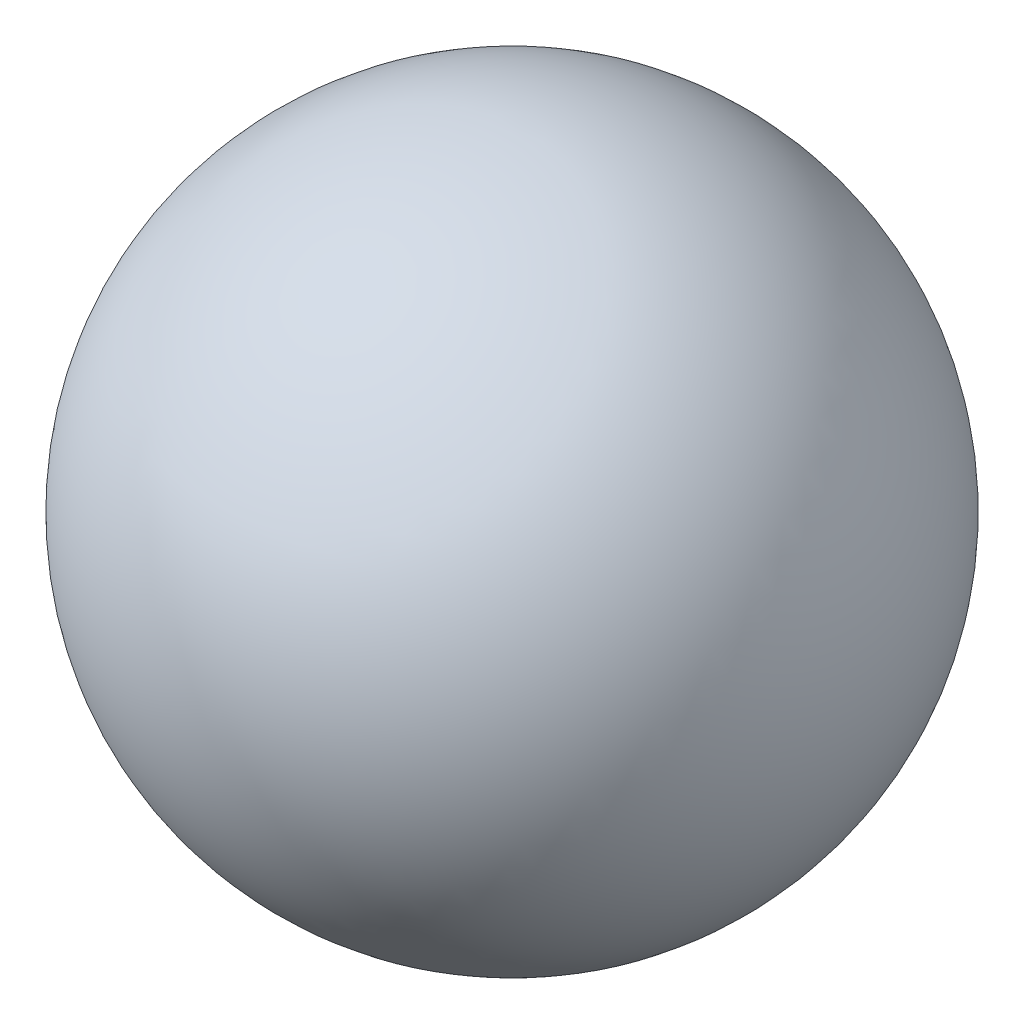
ISO-10303-21;
HEADER;
FILE_DESCRIPTION(('STEP AP214'),'2;1');
FILE_NAME('part.step','',(''),(''),'','','');
FILE_SCHEMA(('AUTOMOTIVE_DESIGN { 1 0 10303 214 1 1 1 1 }'));
ENDSEC;
DATA;
#1=APPLICATION_CONTEXT('core data for automotive mechanical design processes');
#2=APPLICATION_PROTOCOL_DEFINITION('international standard','automotive_design',2000,#1);
#3=PRODUCT_CONTEXT('',#1,'mechanical');
#4=PRODUCT('Part','Part','',(#3));
#5=PRODUCT_RELATED_PRODUCT_CATEGORY('part','',(#4));
#6=PRODUCT_DEFINITION_FORMATION('','',#4);
#7=PRODUCT_DEFINITION_CONTEXT('part definition',#1,'design');
#8=PRODUCT_DEFINITION('design','',#6,#7);
#9=PRODUCT_DEFINITION_SHAPE('','',#8);
#10=(LENGTH_UNIT() NAMED_UNIT(*) SI_UNIT(.MILLI.,.METRE.));
#11=(NAMED_UNIT(*) PLANE_ANGLE_UNIT() SI_UNIT($,.RADIAN.));
#12=(NAMED_UNIT(*) SI_UNIT($,.STERADIAN.) SOLID_ANGLE_UNIT());
#13=UNCERTAINTY_MEASURE_WITH_UNIT(LENGTH_MEASURE(1.E-05),#10,'distance_accuracy_value','');
#14=(GEOMETRIC_REPRESENTATION_CONTEXT(3) GLOBAL_UNCERTAINTY_ASSIGNED_CONTEXT((#13)) GLOBAL_UNIT_ASSIGNED_CONTEXT((#10,
#11,#12)) REPRESENTATION_CONTEXT('',''));
#15=CARTESIAN_POINT('',(0.,0.,0.));
#16=DIRECTION('',(0.,0.,1.));
#17=DIRECTION('',(1.,0.,0.));
#18=AXIS2_PLACEMENT_3D('',#15,#16,#17);
#19=CARTESIAN_POINT('',(0.,0.,0.));
#20=DIRECTION('',(0.,-1.,0.));
#21=DIRECTION('',(0.,0.,1.));
#22=AXIS2_PLACEMENT_3D('',#19,#20,#21);
#23=SPHERICAL_SURFACE('',#22,2.25);
#24=CARTESIAN_POINT('',(0.,-2.25,0.));
#25=VERTEX_POINT('',#24);
#26=VERTEX_LOOP('',#25);
#27=FACE_BOUND('',#26,.T.);
#28=ADVANCED_FACE('F34',(#27),#23,.T.);
#29=CLOSED_SHELL('',(#28));
#30=MANIFOLD_SOLID_BREP('B2',#29);
#31=ADVANCED_BREP_SHAPE_REPRESENTATION('',(#18,#30),#14);
#32=SHAPE_DEFINITION_REPRESENTATION(#9,#31);
ENDSEC;
END-ISO-10303-21;
